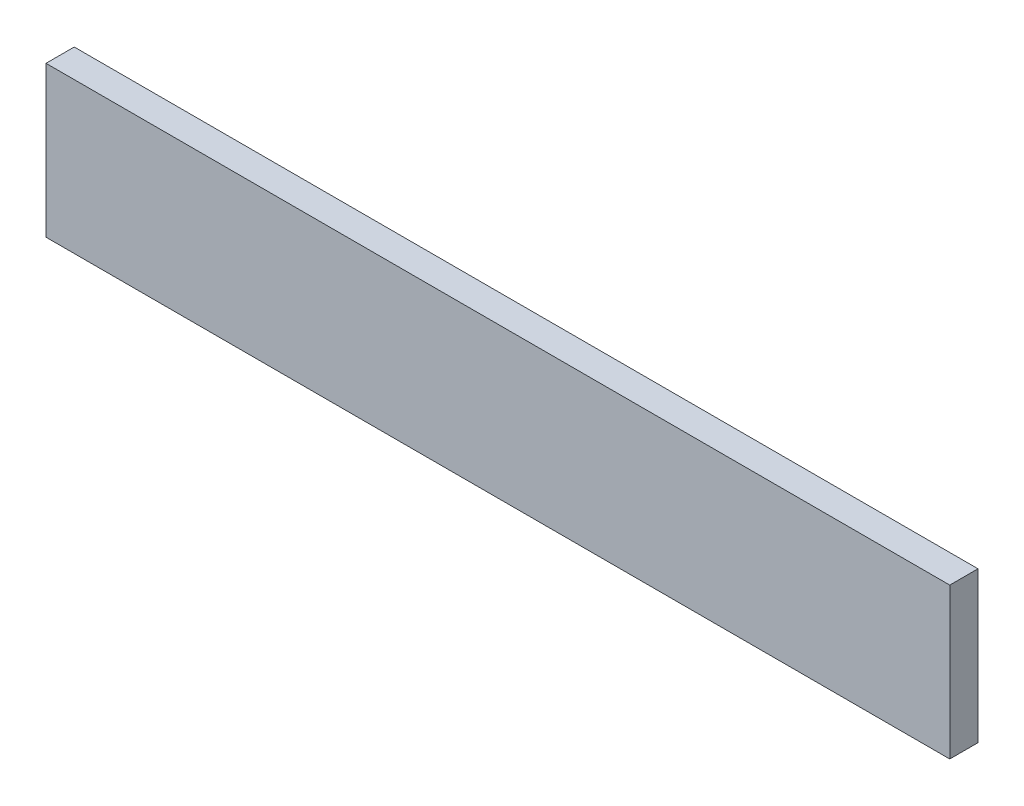
ISO-10303-21;
HEADER;
FILE_DESCRIPTION(('STEP AP214'),'2;1');
FILE_NAME('part.step','',(''),(''),'','','');
FILE_SCHEMA(('AUTOMOTIVE_DESIGN { 1 0 10303 214 1 1 1 1 }'));
ENDSEC;
DATA;
#1=APPLICATION_CONTEXT('core data for automotive mechanical design processes');
#2=APPLICATION_PROTOCOL_DEFINITION('international standard','automotive_design',2000,#1);
#3=PRODUCT_CONTEXT('',#1,'mechanical');
#4=PRODUCT('Part','Part','',(#3));
#5=PRODUCT_RELATED_PRODUCT_CATEGORY('part','',(#4));
#6=PRODUCT_DEFINITION_FORMATION('','',#4);
#7=PRODUCT_DEFINITION_CONTEXT('part definition',#1,'design');
#8=PRODUCT_DEFINITION('design','',#6,#7);
#9=PRODUCT_DEFINITION_SHAPE('','',#8);
#10=(LENGTH_UNIT() NAMED_UNIT(*) SI_UNIT(.MILLI.,.METRE.));
#11=(NAMED_UNIT(*) PLANE_ANGLE_UNIT() SI_UNIT($,.RADIAN.));
#12=(NAMED_UNIT(*) SI_UNIT($,.STERADIAN.) SOLID_ANGLE_UNIT());
#13=UNCERTAINTY_MEASURE_WITH_UNIT(LENGTH_MEASURE(1.E-05),#10,'distance_accuracy_value','');
#14=(GEOMETRIC_REPRESENTATION_CONTEXT(3) GLOBAL_UNCERTAINTY_ASSIGNED_CONTEXT((#13)) GLOBAL_UNIT_ASSIGNED_CONTEXT((#10,
#11,#12)) REPRESENTATION_CONTEXT('',''));
#15=CARTESIAN_POINT('',(0.,0.,0.));
#16=DIRECTION('',(0.,0.,1.));
#17=DIRECTION('',(1.,0.,0.));
#18=AXIS2_PLACEMENT_3D('',#15,#16,#17);
#19=CARTESIAN_POINT('',(0.,0.,9.525));
#20=DIRECTION('',(1.,0.,0.));
#21=DIRECTION('',(0.,0.,-1.));
#22=AXIS2_PLACEMENT_3D('',#19,#20,#21);
#23=PLANE('',#22);
#24=DIRECTION('',(0.,-1.,0.));
#25=VECTOR('',#24,1.);
#26=CARTESIAN_POINT('',(0.,0.,0.));
#27=LINE('',#26,#25);
#28=CARTESIAN_POINT('',(0.,50.8,0.));
#29=VERTEX_POINT('',#28);
#30=CARTESIAN_POINT('',(0.,0.,0.));
#31=VERTEX_POINT('',#30);
#32=EDGE_CURVE('E101',#29,#31,#27,.T.);
#33=ORIENTED_EDGE('',*,*,#32,.T.);
#34=DIRECTION('',(0.,0.,-1.));
#35=VECTOR('',#34,1.);
#36=CARTESIAN_POINT('',(0.,0.,9.525));
#37=LINE('',#36,#35);
#38=CARTESIAN_POINT('',(0.,0.,9.525));
#39=VERTEX_POINT('',#38);
#40=EDGE_CURVE('E11',#39,#31,#37,.T.);
#41=ORIENTED_EDGE('',*,*,#40,.F.);
#42=DIRECTION('',(0.,-1.,0.));
#43=VECTOR('',#42,1.);
#44=CARTESIAN_POINT('',(0.,0.,9.525));
#45=LINE('',#44,#43);
#46=CARTESIAN_POINT('',(0.,50.8,9.525));
#47=VERTEX_POINT('',#46);
#48=EDGE_CURVE('E88',#47,#39,#45,.T.);
#49=ORIENTED_EDGE('',*,*,#48,.F.);
#50=DIRECTION('',(0.,0.,-1.));
#51=VECTOR('',#50,1.);
#52=CARTESIAN_POINT('',(0.,50.8,9.525));
#53=LINE('',#52,#51);
#54=EDGE_CURVE('E97',#47,#29,#53,.T.);
#55=ORIENTED_EDGE('',*,*,#54,.T.);
#56=EDGE_LOOP('',(#33,#41,#49,#55));
#57=FACE_BOUND('',#56,.T.);
#58=ADVANCED_FACE('F37',(#57),#23,.F.);
#59=CARTESIAN_POINT('',(0.,0.,9.525));
#60=DIRECTION('',(0.,1.,0.));
#61=DIRECTION('',(0.,0.,1.));
#62=AXIS2_PLACEMENT_3D('',#59,#60,#61);
#63=PLANE('',#62);
#64=DIRECTION('',(1.,0.,0.));
#65=VECTOR('',#64,1.);
#66=CARTESIAN_POINT('',(0.,0.,0.));
#67=LINE('',#66,#65);
#68=CARTESIAN_POINT('',(304.8,0.,0.));
#69=VERTEX_POINT('',#68);
#70=EDGE_CURVE('E92',#31,#69,#67,.T.);
#71=ORIENTED_EDGE('',*,*,#70,.T.);
#72=DIRECTION('',(0.,0.,-1.));
#73=VECTOR('',#72,1.);
#74=CARTESIAN_POINT('',(304.8,0.,9.525));
#75=LINE('',#74,#73);
#76=CARTESIAN_POINT('',(304.8,0.,9.525));
#77=VERTEX_POINT('',#76);
#78=EDGE_CURVE('E45',#77,#69,#75,.T.);
#79=ORIENTED_EDGE('',*,*,#78,.F.);
#80=DIRECTION('',(1.,0.,0.));
#81=VECTOR('',#80,1.);
#82=CARTESIAN_POINT('',(0.,0.,9.525));
#83=LINE('',#82,#81);
#84=EDGE_CURVE('E83',#39,#77,#83,.T.);
#85=ORIENTED_EDGE('',*,*,#84,.F.);
#86=ORIENTED_EDGE('',*,*,#40,.T.);
#87=EDGE_LOOP('',(#71,#79,#85,#86));
#88=FACE_BOUND('',#87,.T.);
#89=ADVANCED_FACE('F91',(#88),#63,.F.);
#90=CARTESIAN_POINT('',(304.8,0.,9.525));
#91=DIRECTION('',(-1.,0.,0.));
#92=DIRECTION('',(0.,0.,1.));
#93=AXIS2_PLACEMENT_3D('',#90,#91,#92);
#94=PLANE('',#93);
#95=DIRECTION('',(0.,1.,0.));
#96=VECTOR('',#95,1.);
#97=CARTESIAN_POINT('',(304.8,0.,0.));
#98=LINE('',#97,#96);
#99=CARTESIAN_POINT('',(304.8,50.8,0.));
#100=VERTEX_POINT('',#99);
#101=EDGE_CURVE('E70',#69,#100,#98,.T.);
#102=ORIENTED_EDGE('',*,*,#101,.T.);
#103=DIRECTION('',(0.,0.,-1.));
#104=VECTOR('',#103,1.);
#105=CARTESIAN_POINT('',(304.8,50.8,9.525));
#106=LINE('',#105,#104);
#107=CARTESIAN_POINT('',(304.8,50.8,9.525));
#108=VERTEX_POINT('',#107);
#109=EDGE_CURVE('E93',#108,#100,#106,.T.);
#110=ORIENTED_EDGE('',*,*,#109,.F.);
#111=DIRECTION('',(0.,1.,0.));
#112=VECTOR('',#111,1.);
#113=CARTESIAN_POINT('',(304.8,0.,9.525));
#114=LINE('',#113,#112);
#115=EDGE_CURVE('E86',#77,#108,#114,.T.);
#116=ORIENTED_EDGE('',*,*,#115,.F.);
#117=ORIENTED_EDGE('',*,*,#78,.T.);
#118=EDGE_LOOP('',(#102,#110,#116,#117));
#119=FACE_BOUND('',#118,.T.);
#120=ADVANCED_FACE('F94',(#119),#94,.F.);
#121=CARTESIAN_POINT('',(0.,50.8,9.525));
#122=DIRECTION('',(0.,-1.,0.));
#123=DIRECTION('',(0.,0.,-1.));
#124=AXIS2_PLACEMENT_3D('',#121,#122,#123);
#125=PLANE('',#124);
#126=DIRECTION('',(-1.,0.,0.));
#127=VECTOR('',#126,1.);
#128=CARTESIAN_POINT('',(0.,50.8,0.));
#129=LINE('',#128,#127);
#130=EDGE_CURVE('E76',#100,#29,#129,.T.);
#131=ORIENTED_EDGE('',*,*,#130,.T.);
#132=ORIENTED_EDGE('',*,*,#54,.F.);
#133=DIRECTION('',(-1.,0.,0.));
#134=VECTOR('',#133,1.);
#135=CARTESIAN_POINT('',(0.,50.8,9.525));
#136=LINE('',#135,#134);
#137=EDGE_CURVE('E53',#108,#47,#136,.T.);
#138=ORIENTED_EDGE('',*,*,#137,.F.);
#139=ORIENTED_EDGE('',*,*,#109,.T.);
#140=EDGE_LOOP('',(#131,#132,#138,#139));
#141=FACE_BOUND('',#140,.T.);
#142=ADVANCED_FACE('F108',(#141),#125,.F.);
#143=CARTESIAN_POINT('',(0.,0.,9.525));
#144=DIRECTION('',(0.,0.,-1.));
#145=DIRECTION('',(-1.,0.,0.));
#146=AXIS2_PLACEMENT_3D('',#143,#144,#145);
#147=PLANE('',#146);
#148=ORIENTED_EDGE('',*,*,#48,.T.);
#149=ORIENTED_EDGE('',*,*,#84,.T.);
#150=ORIENTED_EDGE('',*,*,#115,.T.);
#151=ORIENTED_EDGE('',*,*,#137,.T.);
#152=EDGE_LOOP('',(#148,#149,#150,#151));
#153=FACE_BOUND('',#152,.T.);
#154=ADVANCED_FACE('F84',(#153),#147,.F.);
#155=CARTESIAN_POINT('',(0.,0.,0.));
#156=DIRECTION('',(0.,0.,-1.));
#157=DIRECTION('',(-1.,0.,0.));
#158=AXIS2_PLACEMENT_3D('',#155,#156,#157);
#159=PLANE('',#158);
#160=ORIENTED_EDGE('',*,*,#32,.F.);
#161=ORIENTED_EDGE('',*,*,#130,.F.);
#162=ORIENTED_EDGE('',*,*,#101,.F.);
#163=ORIENTED_EDGE('',*,*,#70,.F.);
#164=EDGE_LOOP('',(#160,#161,#162,#163));
#165=FACE_BOUND('',#164,.T.);
#166=ADVANCED_FACE('F111',(#165),#159,.T.);
#167=CLOSED_SHELL('',(#58,#89,#120,#142,#154,#166));
#168=MANIFOLD_SOLID_BREP('B2',#167);
#169=ADVANCED_BREP_SHAPE_REPRESENTATION('',(#18,#168),#14);
#170=SHAPE_DEFINITION_REPRESENTATION(#9,#169);
ENDSEC;
END-ISO-10303-21;
